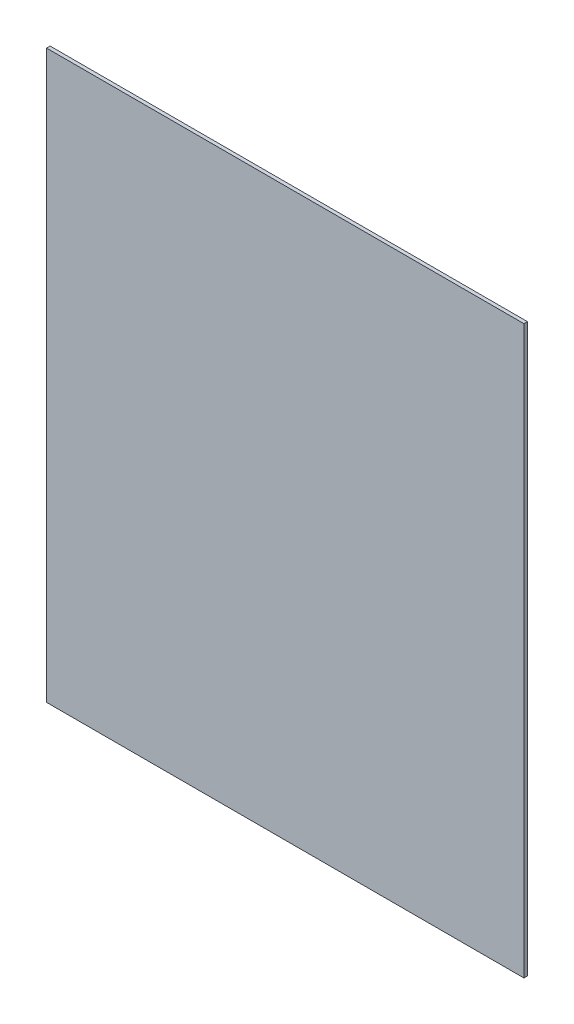
ISO-10303-21;
HEADER;
FILE_DESCRIPTION(('STEP AP214'),'2;1');
FILE_NAME('part.step','',(''),(''),'','','');
FILE_SCHEMA(('AUTOMOTIVE_DESIGN { 1 0 10303 214 1 1 1 1 }'));
ENDSEC;
DATA;
#1=APPLICATION_CONTEXT('core data for automotive mechanical design processes');
#2=APPLICATION_PROTOCOL_DEFINITION('international standard','automotive_design',2000,#1);
#3=PRODUCT_CONTEXT('',#1,'mechanical');
#4=PRODUCT('Part','Part','',(#3));
#5=PRODUCT_RELATED_PRODUCT_CATEGORY('part','',(#4));
#6=PRODUCT_DEFINITION_FORMATION('','',#4);
#7=PRODUCT_DEFINITION_CONTEXT('part definition',#1,'design');
#8=PRODUCT_DEFINITION('design','',#6,#7);
#9=PRODUCT_DEFINITION_SHAPE('','',#8);
#10=(LENGTH_UNIT() NAMED_UNIT(*) SI_UNIT(.MILLI.,.METRE.));
#11=(NAMED_UNIT(*) PLANE_ANGLE_UNIT() SI_UNIT($,.RADIAN.));
#12=(NAMED_UNIT(*) SI_UNIT($,.STERADIAN.) SOLID_ANGLE_UNIT());
#13=UNCERTAINTY_MEASURE_WITH_UNIT(LENGTH_MEASURE(1.E-05),#10,'distance_accuracy_value','');
#14=(GEOMETRIC_REPRESENTATION_CONTEXT(3) GLOBAL_UNCERTAINTY_ASSIGNED_CONTEXT((#13)) GLOBAL_UNIT_ASSIGNED_CONTEXT((#10,
#11,#12)) REPRESENTATION_CONTEXT('',''));
#15=CARTESIAN_POINT('',(0.,0.,0.));
#16=DIRECTION('',(0.,0.,1.));
#17=DIRECTION('',(1.,0.,0.));
#18=AXIS2_PLACEMENT_3D('',#15,#16,#17);
#19=CARTESIAN_POINT('',(0.,0.,3.175));
#20=DIRECTION('',(1.,0.,0.));
#21=DIRECTION('',(0.,0.,-1.));
#22=AXIS2_PLACEMENT_3D('',#19,#20,#21);
#23=PLANE('',#22);
#24=DIRECTION('',(0.,-1.,0.));
#25=VECTOR('',#24,1.);
#26=CARTESIAN_POINT('',(0.,0.,0.));
#27=LINE('',#26,#25);
#28=CARTESIAN_POINT('',(0.,508.,0.));
#29=VERTEX_POINT('',#28);
#30=CARTESIAN_POINT('',(0.,0.,0.));
#31=VERTEX_POINT('',#30);
#32=EDGE_CURVE('E99',#29,#31,#27,.T.);
#33=ORIENTED_EDGE('',*,*,#32,.T.);
#34=DIRECTION('',(0.,0.,-1.));
#35=VECTOR('',#34,1.);
#36=CARTESIAN_POINT('',(0.,0.,3.175));
#37=LINE('',#36,#35);
#38=CARTESIAN_POINT('',(0.,0.,3.175));
#39=VERTEX_POINT('',#38);
#40=EDGE_CURVE('E11',#39,#31,#37,.T.);
#41=ORIENTED_EDGE('',*,*,#40,.F.);
#42=DIRECTION('',(0.,-1.,0.));
#43=VECTOR('',#42,1.);
#44=CARTESIAN_POINT('',(0.,0.,3.175));
#45=LINE('',#44,#43);
#46=CARTESIAN_POINT('',(0.,508.,3.175));
#47=VERTEX_POINT('',#46);
#48=EDGE_CURVE('E87',#47,#39,#45,.T.);
#49=ORIENTED_EDGE('',*,*,#48,.F.);
#50=DIRECTION('',(0.,0.,-1.));
#51=VECTOR('',#50,1.);
#52=CARTESIAN_POINT('',(0.,508.,3.175));
#53=LINE('',#52,#51);
#54=EDGE_CURVE('E95',#47,#29,#53,.T.);
#55=ORIENTED_EDGE('',*,*,#54,.T.);
#56=EDGE_LOOP('',(#33,#41,#49,#55));
#57=FACE_BOUND('',#56,.T.);
#58=ADVANCED_FACE('F36',(#57),#23,.F.);
#59=CARTESIAN_POINT('',(0.,0.,3.175));
#60=DIRECTION('',(0.,1.,0.));
#61=DIRECTION('',(0.,0.,1.));
#62=AXIS2_PLACEMENT_3D('',#59,#60,#61);
#63=PLANE('',#62);
#64=DIRECTION('',(1.,0.,0.));
#65=VECTOR('',#64,1.);
#66=CARTESIAN_POINT('',(0.,0.,0.));
#67=LINE('',#66,#65);
#68=CARTESIAN_POINT('',(427.99,0.,0.));
#69=VERTEX_POINT('',#68);
#70=EDGE_CURVE('E91',#31,#69,#67,.T.);
#71=ORIENTED_EDGE('',*,*,#70,.T.);
#72=DIRECTION('',(0.,0.,-1.));
#73=VECTOR('',#72,1.);
#74=CARTESIAN_POINT('',(427.99,0.,3.175));
#75=LINE('',#74,#73);
#76=CARTESIAN_POINT('',(427.99,0.,3.175));
#77=VERTEX_POINT('',#76);
#78=EDGE_CURVE('E44',#77,#69,#75,.T.);
#79=ORIENTED_EDGE('',*,*,#78,.F.);
#80=DIRECTION('',(1.,0.,0.));
#81=VECTOR('',#80,1.);
#82=CARTESIAN_POINT('',(0.,0.,3.175));
#83=LINE('',#82,#81);
#84=EDGE_CURVE('E82',#39,#77,#83,.T.);
#85=ORIENTED_EDGE('',*,*,#84,.F.);
#86=ORIENTED_EDGE('',*,*,#40,.T.);
#87=EDGE_LOOP('',(#71,#79,#85,#86));
#88=FACE_BOUND('',#87,.T.);
#89=ADVANCED_FACE('F90',(#88),#63,.F.);
#90=CARTESIAN_POINT('',(427.99,0.,3.175));
#91=DIRECTION('',(-1.,0.,0.));
#92=DIRECTION('',(0.,0.,1.));
#93=AXIS2_PLACEMENT_3D('',#90,#91,#92);
#94=PLANE('',#93);
#95=DIRECTION('',(0.,1.,0.));
#96=VECTOR('',#95,1.);
#97=CARTESIAN_POINT('',(427.99,0.,0.));
#98=LINE('',#97,#96);
#99=CARTESIAN_POINT('',(427.99,508.,0.));
#100=VERTEX_POINT('',#99);
#101=EDGE_CURVE('E69',#69,#100,#98,.T.);
#102=ORIENTED_EDGE('',*,*,#101,.T.);
#103=DIRECTION('',(0.,0.,-1.));
#104=VECTOR('',#103,1.);
#105=CARTESIAN_POINT('',(427.99,508.,3.175));
#106=LINE('',#105,#104);
#107=CARTESIAN_POINT('',(427.99,508.,3.175));
#108=VERTEX_POINT('',#107);
#109=EDGE_CURVE('E92',#108,#100,#106,.T.);
#110=ORIENTED_EDGE('',*,*,#109,.F.);
#111=DIRECTION('',(0.,1.,0.));
#112=VECTOR('',#111,1.);
#113=CARTESIAN_POINT('',(427.99,0.,3.175));
#114=LINE('',#113,#112);
#115=EDGE_CURVE('E85',#77,#108,#114,.T.);
#116=ORIENTED_EDGE('',*,*,#115,.F.);
#117=ORIENTED_EDGE('',*,*,#78,.T.);
#118=EDGE_LOOP('',(#102,#110,#116,#117));
#119=FACE_BOUND('',#118,.T.);
#120=ADVANCED_FACE('F93',(#119),#94,.F.);
#121=CARTESIAN_POINT('',(0.,508.,3.175));
#122=DIRECTION('',(0.,-1.,0.));
#123=DIRECTION('',(0.,0.,-1.));
#124=AXIS2_PLACEMENT_3D('',#121,#122,#123);
#125=PLANE('',#124);
#126=DIRECTION('',(-1.,0.,0.));
#127=VECTOR('',#126,1.);
#128=CARTESIAN_POINT('',(0.,508.,0.));
#129=LINE('',#128,#127);
#130=EDGE_CURVE('E75',#100,#29,#129,.T.);
#131=ORIENTED_EDGE('',*,*,#130,.T.);
#132=ORIENTED_EDGE('',*,*,#54,.F.);
#133=DIRECTION('',(-1.,0.,0.));
#134=VECTOR('',#133,1.);
#135=CARTESIAN_POINT('',(0.,508.,3.175));
#136=LINE('',#135,#134);
#137=EDGE_CURVE('E52',#108,#47,#136,.T.);
#138=ORIENTED_EDGE('',*,*,#137,.F.);
#139=ORIENTED_EDGE('',*,*,#109,.T.);
#140=EDGE_LOOP('',(#131,#132,#138,#139));
#141=FACE_BOUND('',#140,.T.);
#142=ADVANCED_FACE('F106',(#141),#125,.F.);
#143=CARTESIAN_POINT('',(0.,0.,3.175));
#144=DIRECTION('',(0.,0.,-1.));
#145=DIRECTION('',(-1.,0.,0.));
#146=AXIS2_PLACEMENT_3D('',#143,#144,#145);
#147=PLANE('',#146);
#148=ORIENTED_EDGE('',*,*,#48,.T.);
#149=ORIENTED_EDGE('',*,*,#84,.T.);
#150=ORIENTED_EDGE('',*,*,#115,.T.);
#151=ORIENTED_EDGE('',*,*,#137,.T.);
#152=EDGE_LOOP('',(#148,#149,#150,#151));
#153=FACE_BOUND('',#152,.T.);
#154=ADVANCED_FACE('F83',(#153),#147,.F.);
#155=CARTESIAN_POINT('',(0.,0.,0.));
#156=DIRECTION('',(0.,0.,-1.));
#157=DIRECTION('',(-1.,0.,0.));
#158=AXIS2_PLACEMENT_3D('',#155,#156,#157);
#159=PLANE('',#158);
#160=ORIENTED_EDGE('',*,*,#32,.F.);
#161=ORIENTED_EDGE('',*,*,#130,.F.);
#162=ORIENTED_EDGE('',*,*,#101,.F.);
#163=ORIENTED_EDGE('',*,*,#70,.F.);
#164=EDGE_LOOP('',(#160,#161,#162,#163));
#165=FACE_BOUND('',#164,.T.);
#166=ADVANCED_FACE('F109',(#165),#159,.T.);
#167=CLOSED_SHELL('',(#58,#89,#120,#142,#154,#166));
#168=MANIFOLD_SOLID_BREP('B2',#167);
#169=ADVANCED_BREP_SHAPE_REPRESENTATION('',(#18,#168),#14);
#170=SHAPE_DEFINITION_REPRESENTATION(#9,#169);
ENDSEC;
END-ISO-10303-21;
